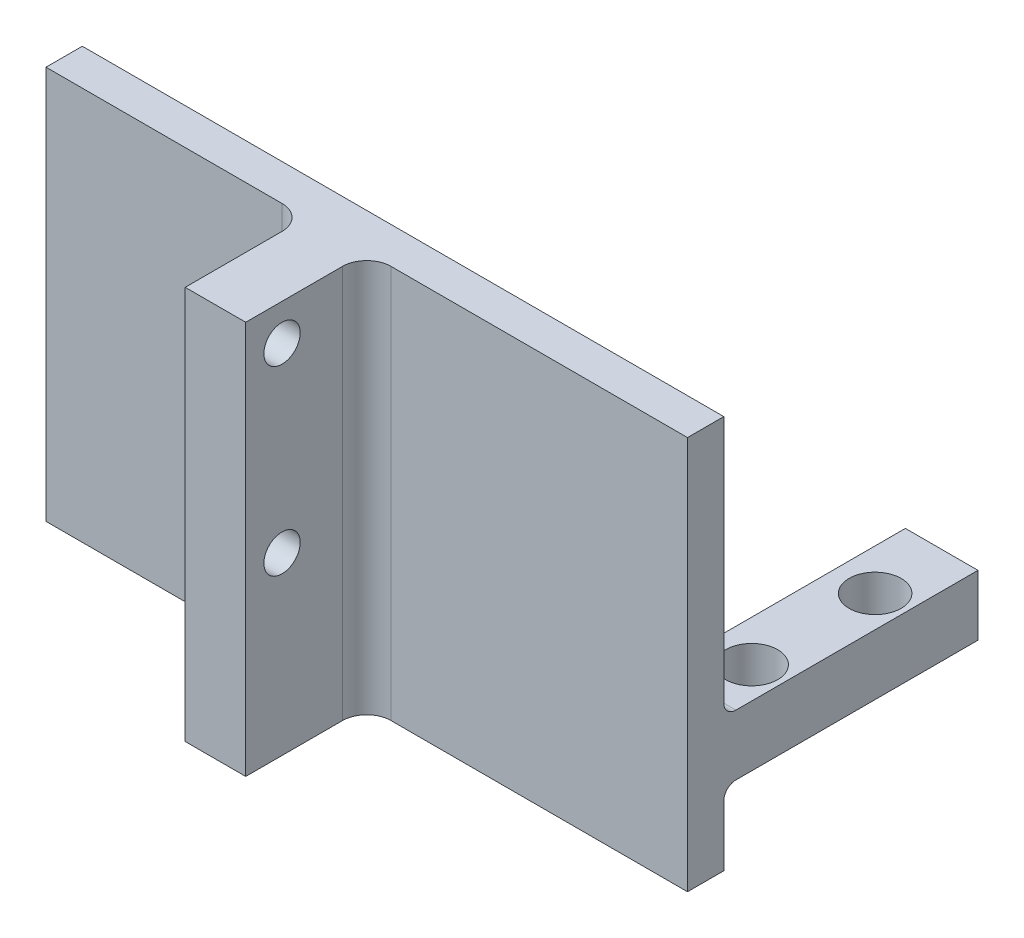
ISO-10303-21;
HEADER;
FILE_DESCRIPTION(('STEP AP214'),'2;1');
FILE_NAME('part.step','',(''),(''),'','','');
FILE_SCHEMA(('AUTOMOTIVE_DESIGN { 1 0 10303 214 1 1 1 1 }'));
ENDSEC;
DATA;
#1=APPLICATION_CONTEXT('core data for automotive mechanical design processes');
#2=APPLICATION_PROTOCOL_DEFINITION('international standard','automotive_design',2000,#1);
#3=PRODUCT_CONTEXT('',#1,'mechanical');
#4=PRODUCT('Part','Part','',(#3));
#5=PRODUCT_RELATED_PRODUCT_CATEGORY('part','',(#4));
#6=PRODUCT_DEFINITION_FORMATION('','',#4);
#7=PRODUCT_DEFINITION_CONTEXT('part definition',#1,'design');
#8=PRODUCT_DEFINITION('design','',#6,#7);
#9=PRODUCT_DEFINITION_SHAPE('','',#8);
#10=(LENGTH_UNIT() NAMED_UNIT(*) SI_UNIT(.MILLI.,.METRE.));
#11=(NAMED_UNIT(*) PLANE_ANGLE_UNIT() SI_UNIT($,.RADIAN.));
#12=(NAMED_UNIT(*) SI_UNIT($,.STERADIAN.) SOLID_ANGLE_UNIT());
#13=UNCERTAINTY_MEASURE_WITH_UNIT(LENGTH_MEASURE(1.E-05),#10,'distance_accuracy_value','');
#14=(GEOMETRIC_REPRESENTATION_CONTEXT(3) GLOBAL_UNCERTAINTY_ASSIGNED_CONTEXT((#13)) GLOBAL_UNIT_ASSIGNED_CONTEXT((#10,
#11,#12)) REPRESENTATION_CONTEXT('',''));
#15=CARTESIAN_POINT('',(0.,0.,0.));
#16=DIRECTION('',(0.,0.,1.));
#17=DIRECTION('',(1.,0.,0.));
#18=AXIS2_PLACEMENT_3D('',#15,#16,#17);
#19=CARTESIAN_POINT('',(0.,0.,3.));
#20=DIRECTION('',(0.,0.,1.));
#21=DIRECTION('',(1.,0.,0.));
#22=AXIS2_PLACEMENT_3D('',#19,#20,#21);
#23=PLANE('',#22);
#24=DIRECTION('',(-1.,0.,0.));
#25=VECTOR('',#24,1.);
#26=CARTESIAN_POINT('',(-26.5,21.5000000000001,3.));
#27=LINE('',#26,#25);
#28=CARTESIAN_POINT('',(26.5,21.5000000000001,3.));
#29=VERTEX_POINT('',#28);
#30=CARTESIAN_POINT('',(2.00000000000002,21.5000000000001,3.));
#31=VERTEX_POINT('',#30);
#32=EDGE_CURVE('E268',#29,#31,#27,.T.);
#33=ORIENTED_EDGE('',*,*,#32,.T.);
#34=DIRECTION('',(0.,1.,0.));
#35=VECTOR('',#34,1.);
#36=CARTESIAN_POINT('',(2.00000000000002,0.,3.));
#37=LINE('',#36,#35);
#38=CARTESIAN_POINT('',(2.00000000000002,-10.9999999999999,3.));
#39=VERTEX_POINT('',#38);
#40=EDGE_CURVE('E53',#31,#39,#37,.F.);
#41=ORIENTED_EDGE('',*,*,#40,.T.);
#42=DIRECTION('',(1.,0.,0.));
#43=VECTOR('',#42,1.);
#44=CARTESIAN_POINT('',(-26.5,-10.9999999999999,3.));
#45=LINE('',#44,#43);
#46=CARTESIAN_POINT('',(26.5,-10.9999999999999,3.));
#47=VERTEX_POINT('',#46);
#48=EDGE_CURVE('E260',#39,#47,#45,.T.);
#49=ORIENTED_EDGE('',*,*,#48,.T.);
#50=DIRECTION('',(0.,1.,0.));
#51=VECTOR('',#50,1.);
#52=CARTESIAN_POINT('',(26.5,21.5000000000001,3.));
#53=LINE('',#52,#51);
#54=EDGE_CURVE('E265',#47,#29,#53,.T.);
#55=ORIENTED_EDGE('',*,*,#54,.T.);
#56=EDGE_LOOP('',(#33,#41,#49,#55));
#57=FACE_BOUND('',#56,.T.);
#58=ADVANCED_FACE('F32',(#57),#23,.T.);
#59=CARTESIAN_POINT('',(0.,0.,0.));
#60=DIRECTION('',(0.,0.,1.));
#61=DIRECTION('',(1.,0.,0.));
#62=AXIS2_PLACEMENT_3D('',#59,#60,#61);
#63=PLANE('',#62);
#64=DIRECTION('',(0.,-1.,0.));
#65=VECTOR('',#64,1.);
#66=CARTESIAN_POINT('',(-20.5,-4.99999999999992,0.));
#67=LINE('',#66,#65);
#68=CARTESIAN_POINT('',(-20.5,1.00000000000009,0.));
#69=VERTEX_POINT('',#68);
#70=CARTESIAN_POINT('',(-20.5,-5.99999999999992,0.));
#71=VERTEX_POINT('',#70);
#72=EDGE_CURVE('E205',#69,#71,#67,.T.);
#73=ORIENTED_EDGE('',*,*,#72,.F.);
#74=DIRECTION('',(1.,0.,0.));
#75=VECTOR('',#74,1.);
#76=CARTESIAN_POINT('',(-26.5,1.00000000000009,0.));
#77=LINE('',#76,#75);
#78=CARTESIAN_POINT('',(-26.5,1.00000000000009,0.));
#79=VERTEX_POINT('',#78);
#80=EDGE_CURVE('E303',#69,#79,#77,.F.);
#81=ORIENTED_EDGE('',*,*,#80,.T.);
#82=DIRECTION('',(0.,-1.,0.));
#83=VECTOR('',#82,1.);
#84=CARTESIAN_POINT('',(-26.5,21.5000000000001,0.));
#85=LINE('',#84,#83);
#86=CARTESIAN_POINT('',(-26.5,21.5000000000001,0.));
#87=VERTEX_POINT('',#86);
#88=EDGE_CURVE('E271',#87,#79,#85,.T.);
#89=ORIENTED_EDGE('',*,*,#88,.F.);
#90=DIRECTION('',(-1.,0.,0.));
#91=VECTOR('',#90,1.);
#92=CARTESIAN_POINT('',(-26.5,21.5000000000001,0.));
#93=LINE('',#92,#91);
#94=CARTESIAN_POINT('',(26.5,21.5000000000001,0.));
#95=VERTEX_POINT('',#94);
#96=EDGE_CURVE('E261',#95,#87,#93,.T.);
#97=ORIENTED_EDGE('',*,*,#96,.F.);
#98=DIRECTION('',(0.,1.,0.));
#99=VECTOR('',#98,1.);
#100=CARTESIAN_POINT('',(26.5,21.5000000000001,0.));
#101=LINE('',#100,#99);
#102=CARTESIAN_POINT('',(26.5,1.00000000000008,0.));
#103=VERTEX_POINT('',#102);
#104=EDGE_CURVE('E276',#103,#95,#101,.T.);
#105=ORIENTED_EDGE('',*,*,#104,.F.);
#106=DIRECTION('',(1.,0.,0.));
#107=VECTOR('',#106,1.);
#108=CARTESIAN_POINT('',(20.5,1.00000000000008,0.));
#109=LINE('',#108,#107);
#110=CARTESIAN_POINT('',(20.5,1.00000000000008,0.));
#111=VERTEX_POINT('',#110);
#112=EDGE_CURVE('E295',#103,#111,#109,.F.);
#113=ORIENTED_EDGE('',*,*,#112,.T.);
#114=DIRECTION('',(0.,1.,0.));
#115=VECTOR('',#114,1.);
#116=CARTESIAN_POINT('',(20.5,-4.99999999999992,0.));
#117=LINE('',#116,#115);
#118=CARTESIAN_POINT('',(20.5,-5.99999999999992,0.));
#119=VERTEX_POINT('',#118);
#120=EDGE_CURVE('E233',#119,#111,#117,.T.);
#121=ORIENTED_EDGE('',*,*,#120,.F.);
#122=DIRECTION('',(-1.,0.,0.));
#123=VECTOR('',#122,1.);
#124=CARTESIAN_POINT('',(26.5,-5.99999999999992,0.));
#125=LINE('',#124,#123);
#126=CARTESIAN_POINT('',(26.5,-5.99999999999992,0.));
#127=VERTEX_POINT('',#126);
#128=EDGE_CURVE('E298',#119,#127,#125,.F.);
#129=ORIENTED_EDGE('',*,*,#128,.T.);
#130=CARTESIAN_POINT('',(26.5,-10.9999999999999,0.));
#131=VERTEX_POINT('',#130);
#132=EDGE_CURVE('E277',#131,#127,#101,.T.);
#133=ORIENTED_EDGE('',*,*,#132,.F.);
#134=DIRECTION('',(1.,0.,0.));
#135=VECTOR('',#134,1.);
#136=CARTESIAN_POINT('',(-26.5,-10.9999999999999,0.));
#137=LINE('',#136,#135);
#138=CARTESIAN_POINT('',(-26.5,-10.9999999999999,0.));
#139=VERTEX_POINT('',#138);
#140=EDGE_CURVE('E274',#139,#131,#137,.T.);
#141=ORIENTED_EDGE('',*,*,#140,.F.);
#142=CARTESIAN_POINT('',(-26.5,-5.99999999999992,0.));
#143=VERTEX_POINT('',#142);
#144=EDGE_CURVE('E256',#143,#139,#85,.T.);
#145=ORIENTED_EDGE('',*,*,#144,.F.);
#146=DIRECTION('',(-1.,0.,0.));
#147=VECTOR('',#146,1.);
#148=CARTESIAN_POINT('',(-20.5,-5.99999999999992,0.));
#149=LINE('',#148,#147);
#150=EDGE_CURVE('E300',#143,#71,#149,.F.);
#151=ORIENTED_EDGE('',*,*,#150,.T.);
#152=EDGE_LOOP('',(#73,#81,#89,#97,#105,#113,#121,#129,#133,#141,#145,#151));
#153=FACE_BOUND('',#152,.T.);
#154=ADVANCED_FACE('F362',(#153),#63,.F.);
#155=CARTESIAN_POINT('',(-26.5,21.5000000000001,3.));
#156=DIRECTION('',(1.,0.,0.));
#157=DIRECTION('',(0.,1.,0.));
#158=AXIS2_PLACEMENT_3D('',#155,#156,#157);
#159=PLANE('',#158);
#160=ORIENTED_EDGE('',*,*,#88,.T.);
#161=CARTESIAN_POINT('',(-26.5,1.00000000000009,-1.));
#162=DIRECTION('',(1.,0.,0.));
#163=DIRECTION('',(0.,1.,0.));
#164=AXIS2_PLACEMENT_3D('',#161,#162,#163);
#165=CIRCLE('',#164,1.);
#166=CARTESIAN_POINT('',(-26.5,0.,-1.00000000000001));
#167=VERTEX_POINT('',#166);
#168=EDGE_CURVE('E317',#79,#167,#165,.T.);
#169=ORIENTED_EDGE('',*,*,#168,.T.);
#170=DIRECTION('',(0.,0.,1.));
#171=VECTOR('',#170,1.);
#172=CARTESIAN_POINT('',(-26.5,0.,-21.));
#173=LINE('',#172,#171);
#174=CARTESIAN_POINT('',(-26.5,0.,-21.));
#175=VERTEX_POINT('',#174);
#176=EDGE_CURVE('E220',#175,#167,#173,.T.);
#177=ORIENTED_EDGE('',*,*,#176,.F.);
#178=DIRECTION('',(0.,1.,0.));
#179=VECTOR('',#178,1.);
#180=CARTESIAN_POINT('',(-26.5,0.,-21.));
#181=LINE('',#180,#179);
#182=CARTESIAN_POINT('',(-26.5,-4.99999999999992,-21.));
#183=VERTEX_POINT('',#182);
#184=EDGE_CURVE('E219',#183,#175,#181,.T.);
#185=ORIENTED_EDGE('',*,*,#184,.F.);
#186=DIRECTION('',(0.,0.,1.));
#187=VECTOR('',#186,1.);
#188=CARTESIAN_POINT('',(-26.5,-4.99999999999992,-21.));
#189=LINE('',#188,#187);
#190=CARTESIAN_POINT('',(-26.5,-4.99999999999992,-1.00000000000001));
#191=VERTEX_POINT('',#190);
#192=EDGE_CURVE('E224',#183,#191,#189,.T.);
#193=ORIENTED_EDGE('',*,*,#192,.T.);
#194=CARTESIAN_POINT('',(-26.5,-5.99999999999992,-1.));
#195=DIRECTION('',(1.,0.,0.));
#196=DIRECTION('',(0.,1.,0.));
#197=AXIS2_PLACEMENT_3D('',#194,#195,#196);
#198=CIRCLE('',#197,1.);
#199=EDGE_CURVE('E319',#191,#143,#198,.T.);
#200=ORIENTED_EDGE('',*,*,#199,.T.);
#201=ORIENTED_EDGE('',*,*,#144,.T.);
#202=DIRECTION('',(0.,0.,-1.));
#203=VECTOR('',#202,1.);
#204=CARTESIAN_POINT('',(-26.5,-10.9999999999999,3.));
#205=LINE('',#204,#203);
#206=CARTESIAN_POINT('',(-26.5,-10.9999999999999,3.));
#207=VERTEX_POINT('',#206);
#208=EDGE_CURVE('E289',#207,#139,#205,.T.);
#209=ORIENTED_EDGE('',*,*,#208,.F.);
#210=DIRECTION('',(0.,-1.,0.));
#211=VECTOR('',#210,1.);
#212=CARTESIAN_POINT('',(-26.5,21.5000000000001,3.));
#213=LINE('',#212,#211);
#214=CARTESIAN_POINT('',(-26.5,21.5000000000001,3.));
#215=VERTEX_POINT('',#214);
#216=EDGE_CURVE('E257',#215,#207,#213,.T.);
#217=ORIENTED_EDGE('',*,*,#216,.F.);
#218=DIRECTION('',(0.,0.,-1.));
#219=VECTOR('',#218,1.);
#220=CARTESIAN_POINT('',(-26.5,21.5000000000001,3.));
#221=LINE('',#220,#219);
#222=EDGE_CURVE('E270',#215,#87,#221,.T.);
#223=ORIENTED_EDGE('',*,*,#222,.T.);
#224=EDGE_LOOP('',(#160,#169,#177,#185,#193,#200,#201,#209,#217,#223));
#225=FACE_BOUND('',#224,.T.);
#226=ADVANCED_FACE('F367',(#225),#159,.F.);
#227=CARTESIAN_POINT('',(-26.5,-10.9999999999999,3.));
#228=DIRECTION('',(0.,1.,0.));
#229=DIRECTION('',(0.,0.,1.));
#230=AXIS2_PLACEMENT_3D('',#227,#228,#229);
#231=PLANE('',#230);
#232=ORIENTED_EDGE('',*,*,#140,.T.);
#233=DIRECTION('',(0.,0.,-1.));
#234=VECTOR('',#233,1.);
#235=CARTESIAN_POINT('',(26.5,-10.9999999999999,3.));
#236=LINE('',#235,#234);
#237=EDGE_CURVE('E286',#47,#131,#236,.T.);
#238=ORIENTED_EDGE('',*,*,#237,.F.);
#239=ORIENTED_EDGE('',*,*,#48,.F.);
#240=CARTESIAN_POINT('',(2.00000000000002,-10.9999999999999,5.));
#241=DIRECTION('',(0.,1.,0.));
#242=DIRECTION('',(0.,0.,1.));
#243=AXIS2_PLACEMENT_3D('',#240,#241,#242);
#244=CIRCLE('',#243,2.);
#245=CARTESIAN_POINT('',(0.,-10.9999999999999,5.));
#246=VERTEX_POINT('',#245);
#247=EDGE_CURVE('E11',#39,#246,#244,.T.);
#248=ORIENTED_EDGE('',*,*,#247,.T.);
#249=DIRECTION('',(0.,0.,-1.));
#250=VECTOR('',#249,1.);
#251=CARTESIAN_POINT('',(0.,-10.9999999999999,13.));
#252=LINE('',#251,#250);
#253=CARTESIAN_POINT('',(0.,-10.9999999999999,13.));
#254=VERTEX_POINT('',#253);
#255=EDGE_CURVE('E209',#254,#246,#252,.T.);
#256=ORIENTED_EDGE('',*,*,#255,.F.);
#257=DIRECTION('',(1.,0.,0.));
#258=VECTOR('',#257,1.);
#259=CARTESIAN_POINT('',(0.,-10.9999999999999,13.));
#260=LINE('',#259,#258);
#261=CARTESIAN_POINT('',(-4.99999999999997,-10.9999999999999,13.));
#262=VERTEX_POINT('',#261);
#263=EDGE_CURVE('E191',#262,#254,#260,.T.);
#264=ORIENTED_EDGE('',*,*,#263,.F.);
#265=DIRECTION('',(0.,0.,-1.));
#266=VECTOR('',#265,1.);
#267=CARTESIAN_POINT('',(-4.99999999999997,-10.9999999999999,13.));
#268=LINE('',#267,#266);
#269=CARTESIAN_POINT('',(-4.99999999999997,-10.9999999999999,5.));
#270=VERTEX_POINT('',#269);
#271=EDGE_CURVE('E188',#262,#270,#268,.T.);
#272=ORIENTED_EDGE('',*,*,#271,.T.);
#273=CARTESIAN_POINT('',(-6.99999999999997,-10.9999999999999,5.));
#274=DIRECTION('',(0.,1.,0.));
#275=DIRECTION('',(0.,0.,1.));
#276=AXIS2_PLACEMENT_3D('',#273,#274,#275);
#277=CIRCLE('',#276,2.);
#278=CARTESIAN_POINT('',(-6.99999999999997,-10.9999999999999,3.));
#279=VERTEX_POINT('',#278);
#280=EDGE_CURVE('E340',#270,#279,#277,.T.);
#281=ORIENTED_EDGE('',*,*,#280,.T.);
#282=EDGE_CURVE('E262',#207,#279,#45,.T.);
#283=ORIENTED_EDGE('',*,*,#282,.F.);
#284=ORIENTED_EDGE('',*,*,#208,.T.);
#285=EDGE_LOOP('',(#232,#238,#239,#248,#256,#264,#272,#281,#283,#284));
#286=FACE_BOUND('',#285,.T.);
#287=ADVANCED_FACE('F343',(#286),#231,.F.);
#288=CARTESIAN_POINT('',(26.5,21.5000000000001,3.));
#289=DIRECTION('',(-1.,0.,0.));
#290=DIRECTION('',(0.,-1.,0.));
#291=AXIS2_PLACEMENT_3D('',#288,#289,#290);
#292=PLANE('',#291);
#293=ORIENTED_EDGE('',*,*,#132,.T.);
#294=CARTESIAN_POINT('',(26.5,-5.99999999999992,-1.));
#295=DIRECTION('',(-1.,0.,0.));
#296=DIRECTION('',(0.,-1.,0.));
#297=AXIS2_PLACEMENT_3D('',#294,#295,#296);
#298=CIRCLE('',#297,1.);
#299=CARTESIAN_POINT('',(26.5,-4.99999999999992,-1.00000000000001));
#300=VERTEX_POINT('',#299);
#301=EDGE_CURVE('E326',#127,#300,#298,.T.);
#302=ORIENTED_EDGE('',*,*,#301,.T.);
#303=DIRECTION('',(0.,0.,1.));
#304=VECTOR('',#303,1.);
#305=CARTESIAN_POINT('',(26.5,-4.99999999999992,-21.));
#306=LINE('',#305,#304);
#307=CARTESIAN_POINT('',(26.5,-4.99999999999992,-21.));
#308=VERTEX_POINT('',#307);
#309=EDGE_CURVE('E247',#308,#300,#306,.T.);
#310=ORIENTED_EDGE('',*,*,#309,.F.);
#311=DIRECTION('',(0.,-1.,0.));
#312=VECTOR('',#311,1.);
#313=CARTESIAN_POINT('',(26.5,0.,-21.));
#314=LINE('',#313,#312);
#315=CARTESIAN_POINT('',(26.5,0.,-21.));
#316=VERTEX_POINT('',#315);
#317=EDGE_CURVE('E239',#316,#308,#314,.T.);
#318=ORIENTED_EDGE('',*,*,#317,.F.);
#319=DIRECTION('',(0.,0.,1.));
#320=VECTOR('',#319,1.);
#321=CARTESIAN_POINT('',(26.5,0.,-21.));
#322=LINE('',#321,#320);
#323=CARTESIAN_POINT('',(26.5,0.,-1.00000000000001));
#324=VERTEX_POINT('',#323);
#325=EDGE_CURVE('E250',#316,#324,#322,.T.);
#326=ORIENTED_EDGE('',*,*,#325,.T.);
#327=CARTESIAN_POINT('',(26.5,1.00000000000008,-1.));
#328=DIRECTION('',(-1.,0.,0.));
#329=DIRECTION('',(0.,-1.,0.));
#330=AXIS2_PLACEMENT_3D('',#327,#328,#329);
#331=CIRCLE('',#330,1.);
#332=EDGE_CURVE('E328',#324,#103,#331,.T.);
#333=ORIENTED_EDGE('',*,*,#332,.T.);
#334=ORIENTED_EDGE('',*,*,#104,.T.);
#335=DIRECTION('',(0.,0.,-1.));
#336=VECTOR('',#335,1.);
#337=CARTESIAN_POINT('',(26.5,21.5000000000001,3.));
#338=LINE('',#337,#336);
#339=EDGE_CURVE('E283',#29,#95,#338,.T.);
#340=ORIENTED_EDGE('',*,*,#339,.F.);
#341=ORIENTED_EDGE('',*,*,#54,.F.);
#342=ORIENTED_EDGE('',*,*,#237,.T.);
#343=EDGE_LOOP('',(#293,#302,#310,#318,#326,#333,#334,#340,#341,#342));
#344=FACE_BOUND('',#343,.T.);
#345=ADVANCED_FACE('F379',(#344),#292,.F.);
#346=CARTESIAN_POINT('',(-26.5,21.5000000000001,3.));
#347=DIRECTION('',(0.,-1.,0.));
#348=DIRECTION('',(0.,0.,-1.));
#349=AXIS2_PLACEMENT_3D('',#346,#347,#348);
#350=PLANE('',#349);
#351=ORIENTED_EDGE('',*,*,#96,.T.);
#352=ORIENTED_EDGE('',*,*,#222,.F.);
#353=CARTESIAN_POINT('',(-6.99999999999998,21.5000000000001,3.));
#354=VERTEX_POINT('',#353);
#355=EDGE_CURVE('E267',#354,#215,#27,.T.);
#356=ORIENTED_EDGE('',*,*,#355,.F.);
#357=CARTESIAN_POINT('',(-6.99999999999998,21.5000000000001,5.));
#358=DIRECTION('',(0.,-1.,0.));
#359=DIRECTION('',(0.,0.,-1.));
#360=AXIS2_PLACEMENT_3D('',#357,#358,#359);
#361=CIRCLE('',#360,2.);
#362=CARTESIAN_POINT('',(-4.99999999999998,21.5000000000001,5.));
#363=VERTEX_POINT('',#362);
#364=EDGE_CURVE('E204',#354,#363,#361,.T.);
#365=ORIENTED_EDGE('',*,*,#364,.T.);
#366=DIRECTION('',(0.,0.,-1.));
#367=VECTOR('',#366,1.);
#368=CARTESIAN_POINT('',(-4.99999999999998,21.5000000000001,13.));
#369=LINE('',#368,#367);
#370=CARTESIAN_POINT('',(-4.99999999999998,21.5000000000001,13.));
#371=VERTEX_POINT('',#370);
#372=EDGE_CURVE('E185',#371,#363,#369,.T.);
#373=ORIENTED_EDGE('',*,*,#372,.F.);
#374=DIRECTION('',(-1.,0.,0.));
#375=VECTOR('',#374,1.);
#376=CARTESIAN_POINT('',(-4.99999999999998,21.5000000000001,13.));
#377=LINE('',#376,#375);
#378=CARTESIAN_POINT('',(0.,21.5000000000001,13.));
#379=VERTEX_POINT('',#378);
#380=EDGE_CURVE('E192',#379,#371,#377,.T.);
#381=ORIENTED_EDGE('',*,*,#380,.F.);
#382=DIRECTION('',(0.,0.,-1.));
#383=VECTOR('',#382,1.);
#384=CARTESIAN_POINT('',(0.,21.5000000000001,13.));
#385=LINE('',#384,#383);
#386=CARTESIAN_POINT('',(0.,21.5000000000001,5.));
#387=VERTEX_POINT('',#386);
#388=EDGE_CURVE('E465',#379,#387,#385,.T.);
#389=ORIENTED_EDGE('',*,*,#388,.T.);
#390=CARTESIAN_POINT('',(2.00000000000002,21.5000000000001,5.));
#391=DIRECTION('',(0.,-1.,0.));
#392=DIRECTION('',(0.,0.,-1.));
#393=AXIS2_PLACEMENT_3D('',#390,#391,#392);
#394=CIRCLE('',#393,2.);
#395=EDGE_CURVE('E40',#387,#31,#394,.T.);
#396=ORIENTED_EDGE('',*,*,#395,.T.);
#397=ORIENTED_EDGE('',*,*,#32,.F.);
#398=ORIENTED_EDGE('',*,*,#339,.T.);
#399=EDGE_LOOP('',(#351,#352,#356,#365,#373,#381,#389,#396,#397,#398));
#400=FACE_BOUND('',#399,.T.);
#401=ADVANCED_FACE('F201',(#400),#350,.F.);
#402=ORIENTED_EDGE('',*,*,#282,.T.);
#403=DIRECTION('',(0.,-1.,0.));
#404=VECTOR('',#403,1.);
#405=CARTESIAN_POINT('',(-6.99999999999997,0.,3.));
#406=LINE('',#405,#404);
#407=EDGE_CURVE('E334',#279,#354,#406,.F.);
#408=ORIENTED_EDGE('',*,*,#407,.T.);
#409=ORIENTED_EDGE('',*,*,#355,.T.);
#410=ORIENTED_EDGE('',*,*,#216,.T.);
#411=EDGE_LOOP('',(#402,#408,#409,#410));
#412=FACE_BOUND('',#411,.T.);
#413=ADVANCED_FACE('F347',(#412),#23,.T.);
#414=CARTESIAN_POINT('',(20.5,-4.99999999999992,-21.));
#415=DIRECTION('',(1.,0.,0.));
#416=DIRECTION('',(0.,0.,-1.));
#417=AXIS2_PLACEMENT_3D('',#414,#415,#416);
#418=PLANE('',#417);
#419=ORIENTED_EDGE('',*,*,#120,.T.);
#420=CARTESIAN_POINT('',(20.5,1.00000000000008,-1.));
#421=DIRECTION('',(1.,0.,0.));
#422=DIRECTION('',(0.,0.,-1.));
#423=AXIS2_PLACEMENT_3D('',#420,#421,#422);
#424=CIRCLE('',#423,1.);
#425=CARTESIAN_POINT('',(20.5,0.,-1.00000000000001));
#426=VERTEX_POINT('',#425);
#427=EDGE_CURVE('E330',#111,#426,#424,.T.);
#428=ORIENTED_EDGE('',*,*,#427,.T.);
#429=DIRECTION('',(0.,0.,1.));
#430=VECTOR('',#429,1.);
#431=CARTESIAN_POINT('',(20.5,0.,-21.));
#432=LINE('',#431,#430);
#433=CARTESIAN_POINT('',(20.5,0.,-21.));
#434=VERTEX_POINT('',#433);
#435=EDGE_CURVE('E253',#434,#426,#432,.T.);
#436=ORIENTED_EDGE('',*,*,#435,.F.);
#437=DIRECTION('',(0.,1.,0.));
#438=VECTOR('',#437,1.);
#439=CARTESIAN_POINT('',(20.5,-4.99999999999992,-21.));
#440=LINE('',#439,#438);
#441=CARTESIAN_POINT('',(20.5,-4.99999999999992,-21.));
#442=VERTEX_POINT('',#441);
#443=EDGE_CURVE('E234',#442,#434,#440,.T.);
#444=ORIENTED_EDGE('',*,*,#443,.F.);
#445=DIRECTION('',(0.,0.,1.));
#446=VECTOR('',#445,1.);
#447=CARTESIAN_POINT('',(20.5,-4.99999999999992,-21.));
#448=LINE('',#447,#446);
#449=CARTESIAN_POINT('',(20.5,-4.99999999999992,-1.00000000000001));
#450=VERTEX_POINT('',#449);
#451=EDGE_CURVE('E243',#442,#450,#448,.T.);
#452=ORIENTED_EDGE('',*,*,#451,.T.);
#453=CARTESIAN_POINT('',(20.5,-5.99999999999992,-1.));
#454=DIRECTION('',(1.,0.,0.));
#455=DIRECTION('',(0.,0.,-1.));
#456=AXIS2_PLACEMENT_3D('',#453,#454,#455);
#457=CIRCLE('',#456,1.);
#458=EDGE_CURVE('E323',#450,#119,#457,.T.);
#459=ORIENTED_EDGE('',*,*,#458,.T.);
#460=EDGE_LOOP('',(#419,#428,#436,#444,#452,#459));
#461=FACE_BOUND('',#460,.T.);
#462=ADVANCED_FACE('F372',(#461),#418,.F.);
#463=CARTESIAN_POINT('',(20.5,0.,-21.));
#464=DIRECTION('',(0.,-1.,0.));
#465=DIRECTION('',(1.,0.,0.));
#466=AXIS2_PLACEMENT_3D('',#463,#464,#465);
#467=PLANE('',#466);
#468=CARTESIAN_POINT('',(23.9,0.,-15.1));
#469=DIRECTION('',(0.,-1.,0.));
#470=DIRECTION('',(1.,0.,0.));
#471=AXIS2_PLACEMENT_3D('',#468,#469,#470);
#472=CIRCLE('',#471,2.15);
#473=CARTESIAN_POINT('',(26.05,0.,-15.1));
#474=VERTEX_POINT('',#473);
#475=EDGE_CURVE('E199',#474,#474,#472,.T.);
#476=ORIENTED_EDGE('',*,*,#475,.T.);
#477=EDGE_LOOP('',(#476));
#478=FACE_BOUND('',#477,.T.);
#479=CARTESIAN_POINT('',(23.9,0.,-4.9));
#480=DIRECTION('',(0.,-1.,0.));
#481=DIRECTION('',(1.,0.,0.));
#482=AXIS2_PLACEMENT_3D('',#479,#480,#481);
#483=CIRCLE('',#482,2.15);
#484=CARTESIAN_POINT('',(26.05,0.,-4.9));
#485=VERTEX_POINT('',#484);
#486=EDGE_CURVE('E472',#485,#485,#483,.T.);
#487=ORIENTED_EDGE('',*,*,#486,.T.);
#488=EDGE_LOOP('',(#487));
#489=FACE_BOUND('',#488,.T.);
#490=ORIENTED_EDGE('',*,*,#435,.T.);
#491=DIRECTION('',(1.,0.,0.));
#492=VECTOR('',#491,1.);
#493=CARTESIAN_POINT('',(26.5,0.,-1.));
#494=LINE('',#493,#492);
#495=EDGE_CURVE('E311',#426,#324,#494,.T.);
#496=ORIENTED_EDGE('',*,*,#495,.T.);
#497=ORIENTED_EDGE('',*,*,#325,.F.);
#498=DIRECTION('',(1.,0.,0.));
#499=VECTOR('',#498,1.);
#500=CARTESIAN_POINT('',(20.5,0.,-21.));
#501=LINE('',#500,#499);
#502=EDGE_CURVE('E237',#434,#316,#501,.T.);
#503=ORIENTED_EDGE('',*,*,#502,.F.);
#504=EDGE_LOOP('',(#490,#496,#497,#503));
#505=FACE_BOUND('',#504,.T.);
#506=ADVANCED_FACE('F377',(#478,#489,#505),#467,.F.);
#507=CARTESIAN_POINT('',(20.5,-4.99999999999992,-21.));
#508=DIRECTION('',(0.,1.,0.));
#509=DIRECTION('',(0.,0.,1.));
#510=AXIS2_PLACEMENT_3D('',#507,#508,#509);
#511=PLANE('',#510);
#512=CARTESIAN_POINT('',(23.9,-4.99999999999992,-15.1));
#513=DIRECTION('',(0.,-1.,0.));
#514=DIRECTION('',(0.,0.,-1.));
#515=AXIS2_PLACEMENT_3D('',#512,#513,#514);
#516=CIRCLE('',#515,2.15);
#517=CARTESIAN_POINT('',(23.9,-4.99999999999992,-17.25));
#518=VERTEX_POINT('',#517);
#519=EDGE_CURVE('E484',#518,#518,#516,.T.);
#520=ORIENTED_EDGE('',*,*,#519,.F.);
#521=EDGE_LOOP('',(#520));
#522=FACE_BOUND('',#521,.T.);
#523=CARTESIAN_POINT('',(23.9,-4.99999999999992,-4.9));
#524=DIRECTION('',(0.,-1.,0.));
#525=DIRECTION('',(0.,0.,-1.));
#526=AXIS2_PLACEMENT_3D('',#523,#524,#525);
#527=CIRCLE('',#526,2.15);
#528=CARTESIAN_POINT('',(23.9,-4.99999999999992,-7.05));
#529=VERTEX_POINT('',#528);
#530=EDGE_CURVE('E481',#529,#529,#527,.T.);
#531=ORIENTED_EDGE('',*,*,#530,.F.);
#532=EDGE_LOOP('',(#531));
#533=FACE_BOUND('',#532,.T.);
#534=ORIENTED_EDGE('',*,*,#309,.T.);
#535=DIRECTION('',(-1.,0.,0.));
#536=VECTOR('',#535,1.);
#537=CARTESIAN_POINT('',(20.5,-4.99999999999992,-1.));
#538=LINE('',#537,#536);
#539=EDGE_CURVE('E308',#300,#450,#538,.T.);
#540=ORIENTED_EDGE('',*,*,#539,.T.);
#541=ORIENTED_EDGE('',*,*,#451,.F.);
#542=DIRECTION('',(-1.,0.,0.));
#543=VECTOR('',#542,1.);
#544=CARTESIAN_POINT('',(20.5,-4.99999999999992,-21.));
#545=LINE('',#544,#543);
#546=EDGE_CURVE('E241',#308,#442,#545,.T.);
#547=ORIENTED_EDGE('',*,*,#546,.F.);
#548=EDGE_LOOP('',(#534,#540,#541,#547));
#549=FACE_BOUND('',#548,.T.);
#550=ADVANCED_FACE('F426',(#522,#533,#549),#511,.F.);
#551=CARTESIAN_POINT('',(0.,0.,-21.));
#552=DIRECTION('',(0.,0.,-1.));
#553=DIRECTION('',(-1.,0.,0.));
#554=AXIS2_PLACEMENT_3D('',#551,#552,#553);
#555=PLANE('',#554);
#556=ORIENTED_EDGE('',*,*,#443,.T.);
#557=ORIENTED_EDGE('',*,*,#502,.T.);
#558=ORIENTED_EDGE('',*,*,#317,.T.);
#559=ORIENTED_EDGE('',*,*,#546,.T.);
#560=EDGE_LOOP('',(#556,#557,#558,#559));
#561=FACE_BOUND('',#560,.T.);
#562=ADVANCED_FACE('F421',(#561),#555,.T.);
#563=CARTESIAN_POINT('',(-20.5,0.,-21.));
#564=DIRECTION('',(0.,-1.,0.));
#565=DIRECTION('',(1.,0.,0.));
#566=AXIS2_PLACEMENT_3D('',#563,#564,#565);
#567=PLANE('',#566);
#568=CARTESIAN_POINT('',(-23.9,0.,-4.9));
#569=DIRECTION('',(0.,-1.,0.));
#570=DIRECTION('',(1.,0.,0.));
#571=AXIS2_PLACEMENT_3D('',#568,#569,#570);
#572=CIRCLE('',#571,2.15);
#573=CARTESIAN_POINT('',(-21.75,0.,-4.9));
#574=VERTEX_POINT('',#573);
#575=EDGE_CURVE('E475',#574,#574,#572,.T.);
#576=ORIENTED_EDGE('',*,*,#575,.T.);
#577=EDGE_LOOP('',(#576));
#578=FACE_BOUND('',#577,.T.);
#579=CARTESIAN_POINT('',(-23.9,0.,-15.1));
#580=DIRECTION('',(0.,-1.,0.));
#581=DIRECTION('',(1.,0.,0.));
#582=AXIS2_PLACEMENT_3D('',#579,#580,#581);
#583=CIRCLE('',#582,2.15);
#584=CARTESIAN_POINT('',(-21.75,0.,-15.1));
#585=VERTEX_POINT('',#584);
#586=EDGE_CURVE('E478',#585,#585,#583,.T.);
#587=ORIENTED_EDGE('',*,*,#586,.T.);
#588=EDGE_LOOP('',(#587));
#589=FACE_BOUND('',#588,.T.);
#590=ORIENTED_EDGE('',*,*,#176,.T.);
#591=DIRECTION('',(1.,0.,0.));
#592=VECTOR('',#591,1.);
#593=CARTESIAN_POINT('',(-20.5,0.,-1.));
#594=LINE('',#593,#592);
#595=CARTESIAN_POINT('',(-20.5,0.,-1.00000000000001));
#596=VERTEX_POINT('',#595);
#597=EDGE_CURVE('E292',#167,#596,#594,.T.);
#598=ORIENTED_EDGE('',*,*,#597,.T.);
#599=DIRECTION('',(0.,0.,1.));
#600=VECTOR('',#599,1.);
#601=CARTESIAN_POINT('',(-20.5,0.,-21.));
#602=LINE('',#601,#600);
#603=CARTESIAN_POINT('',(-20.5,0.,-21.));
#604=VERTEX_POINT('',#603);
#605=EDGE_CURVE('E230',#604,#596,#602,.T.);
#606=ORIENTED_EDGE('',*,*,#605,.F.);
#607=DIRECTION('',(1.,0.,0.));
#608=VECTOR('',#607,1.);
#609=CARTESIAN_POINT('',(-20.5,0.,-21.));
#610=LINE('',#609,#608);
#611=EDGE_CURVE('E207',#175,#604,#610,.T.);
#612=ORIENTED_EDGE('',*,*,#611,.F.);
#613=EDGE_LOOP('',(#590,#598,#606,#612));
#614=FACE_BOUND('',#613,.T.);
#615=ADVANCED_FACE('F454',(#578,#589,#614),#567,.F.);
#616=CARTESIAN_POINT('',(-20.5,-4.99999999999992,-21.));
#617=DIRECTION('',(-1.,0.,0.));
#618=DIRECTION('',(0.,0.,1.));
#619=AXIS2_PLACEMENT_3D('',#616,#617,#618);
#620=PLANE('',#619);
#621=ORIENTED_EDGE('',*,*,#72,.T.);
#622=CARTESIAN_POINT('',(-20.5,-5.99999999999992,-1.));
#623=DIRECTION('',(-1.,0.,0.));
#624=DIRECTION('',(0.,0.,1.));
#625=AXIS2_PLACEMENT_3D('',#622,#623,#624);
#626=CIRCLE('',#625,1.);
#627=CARTESIAN_POINT('',(-20.5,-4.99999999999992,-1.00000000000001));
#628=VERTEX_POINT('',#627);
#629=EDGE_CURVE('E321',#71,#628,#626,.T.);
#630=ORIENTED_EDGE('',*,*,#629,.T.);
#631=DIRECTION('',(0.,0.,1.));
#632=VECTOR('',#631,1.);
#633=CARTESIAN_POINT('',(-20.5,-4.99999999999992,-21.));
#634=LINE('',#633,#632);
#635=CARTESIAN_POINT('',(-20.5,-4.99999999999992,-21.));
#636=VERTEX_POINT('',#635);
#637=EDGE_CURVE('E227',#636,#628,#634,.T.);
#638=ORIENTED_EDGE('',*,*,#637,.F.);
#639=DIRECTION('',(0.,-1.,0.));
#640=VECTOR('',#639,1.);
#641=CARTESIAN_POINT('',(-20.5,-4.99999999999992,-21.));
#642=LINE('',#641,#640);
#643=EDGE_CURVE('E215',#604,#636,#642,.T.);
#644=ORIENTED_EDGE('',*,*,#643,.F.);
#645=ORIENTED_EDGE('',*,*,#605,.T.);
#646=CARTESIAN_POINT('',(-20.5,1.00000000000009,-1.));
#647=DIRECTION('',(-1.,0.,0.));
#648=DIRECTION('',(0.,0.,1.));
#649=AXIS2_PLACEMENT_3D('',#646,#647,#648);
#650=CIRCLE('',#649,1.);
#651=EDGE_CURVE('E314',#596,#69,#650,.T.);
#652=ORIENTED_EDGE('',*,*,#651,.T.);
#653=EDGE_LOOP('',(#621,#630,#638,#644,#645,#652));
#654=FACE_BOUND('',#653,.T.);
#655=ADVANCED_FACE('F442',(#654),#620,.F.);
#656=CARTESIAN_POINT('',(-20.5,-4.99999999999992,-21.));
#657=DIRECTION('',(0.,1.,0.));
#658=DIRECTION('',(0.,0.,1.));
#659=AXIS2_PLACEMENT_3D('',#656,#657,#658);
#660=PLANE('',#659);
#661=CARTESIAN_POINT('',(-23.9,-4.99999999999992,-4.9));
#662=DIRECTION('',(0.,-1.,0.));
#663=DIRECTION('',(0.,0.,-1.));
#664=AXIS2_PLACEMENT_3D('',#661,#662,#663);
#665=CIRCLE('',#664,2.15);
#666=CARTESIAN_POINT('',(-23.9,-4.99999999999992,-7.05));
#667=VERTEX_POINT('',#666);
#668=EDGE_CURVE('E485',#667,#667,#665,.T.);
#669=ORIENTED_EDGE('',*,*,#668,.F.);
#670=EDGE_LOOP('',(#669));
#671=FACE_BOUND('',#670,.T.);
#672=CARTESIAN_POINT('',(-23.9,-4.99999999999992,-15.1));
#673=DIRECTION('',(0.,-1.,0.));
#674=DIRECTION('',(0.,0.,-1.));
#675=AXIS2_PLACEMENT_3D('',#672,#673,#674);
#676=CIRCLE('',#675,2.15);
#677=CARTESIAN_POINT('',(-23.9,-4.99999999999992,-17.25));
#678=VERTEX_POINT('',#677);
#679=EDGE_CURVE('E488',#678,#678,#676,.T.);
#680=ORIENTED_EDGE('',*,*,#679,.F.);
#681=EDGE_LOOP('',(#680));
#682=FACE_BOUND('',#681,.T.);
#683=ORIENTED_EDGE('',*,*,#637,.T.);
#684=DIRECTION('',(-1.,0.,0.));
#685=VECTOR('',#684,1.);
#686=CARTESIAN_POINT('',(-26.5,-4.99999999999992,-1.));
#687=LINE('',#686,#685);
#688=EDGE_CURVE('E305',#628,#191,#687,.T.);
#689=ORIENTED_EDGE('',*,*,#688,.T.);
#690=ORIENTED_EDGE('',*,*,#192,.F.);
#691=DIRECTION('',(-1.,0.,0.));
#692=VECTOR('',#691,1.);
#693=CARTESIAN_POINT('',(-20.5,-4.99999999999992,-21.));
#694=LINE('',#693,#692);
#695=EDGE_CURVE('E217',#636,#183,#694,.T.);
#696=ORIENTED_EDGE('',*,*,#695,.F.);
#697=EDGE_LOOP('',(#683,#689,#690,#696));
#698=FACE_BOUND('',#697,.T.);
#699=ADVANCED_FACE('F445',(#671,#682,#698),#660,.F.);
#700=CARTESIAN_POINT('',(0.,0.,-21.));
#701=DIRECTION('',(0.,0.,1.));
#702=DIRECTION('',(1.,0.,0.));
#703=AXIS2_PLACEMENT_3D('',#700,#701,#702);
#704=PLANE('',#703);
#705=ORIENTED_EDGE('',*,*,#611,.T.);
#706=ORIENTED_EDGE('',*,*,#643,.T.);
#707=ORIENTED_EDGE('',*,*,#695,.T.);
#708=ORIENTED_EDGE('',*,*,#184,.T.);
#709=EDGE_LOOP('',(#705,#706,#707,#708));
#710=FACE_BOUND('',#709,.T.);
#711=ADVANCED_FACE('F396',(#710),#704,.F.);
#712=CARTESIAN_POINT('',(-20.5,1.00000000000009,-1.));
#713=DIRECTION('',(-1.,0.,0.));
#714=DIRECTION('',(0.,-1.,0.));
#715=AXIS2_PLACEMENT_3D('',#712,#713,#714);
#716=CYLINDRICAL_SURFACE('',#715,1.);
#717=ORIENTED_EDGE('',*,*,#168,.F.);
#718=ORIENTED_EDGE('',*,*,#80,.F.);
#719=ORIENTED_EDGE('',*,*,#651,.F.);
#720=ORIENTED_EDGE('',*,*,#597,.F.);
#721=EDGE_LOOP('',(#717,#718,#719,#720));
#722=FACE_BOUND('',#721,.T.);
#723=ADVANCED_FACE('F392',(#722),#716,.F.);
#724=CARTESIAN_POINT('',(-20.5,-5.99999999999992,-1.));
#725=DIRECTION('',(1.,0.,0.));
#726=DIRECTION('',(0.,0.,-1.));
#727=AXIS2_PLACEMENT_3D('',#724,#725,#726);
#728=CYLINDRICAL_SURFACE('',#727,1.);
#729=ORIENTED_EDGE('',*,*,#629,.F.);
#730=ORIENTED_EDGE('',*,*,#150,.F.);
#731=ORIENTED_EDGE('',*,*,#199,.F.);
#732=ORIENTED_EDGE('',*,*,#688,.F.);
#733=EDGE_LOOP('',(#729,#730,#731,#732));
#734=FACE_BOUND('',#733,.T.);
#735=ADVANCED_FACE('F395',(#734),#728,.F.);
#736=CARTESIAN_POINT('',(20.5,-5.99999999999992,-1.));
#737=DIRECTION('',(1.,0.,0.));
#738=DIRECTION('',(0.,0.,-1.));
#739=AXIS2_PLACEMENT_3D('',#736,#737,#738);
#740=CYLINDRICAL_SURFACE('',#739,1.);
#741=ORIENTED_EDGE('',*,*,#301,.F.);
#742=ORIENTED_EDGE('',*,*,#128,.F.);
#743=ORIENTED_EDGE('',*,*,#458,.F.);
#744=ORIENTED_EDGE('',*,*,#539,.F.);
#745=EDGE_LOOP('',(#741,#742,#743,#744));
#746=FACE_BOUND('',#745,.T.);
#747=ADVANCED_FACE('F400',(#746),#740,.F.);
#748=CARTESIAN_POINT('',(20.5,1.00000000000008,-1.));
#749=DIRECTION('',(-1.,0.,0.));
#750=DIRECTION('',(0.,-1.,0.));
#751=AXIS2_PLACEMENT_3D('',#748,#749,#750);
#752=CYLINDRICAL_SURFACE('',#751,1.);
#753=ORIENTED_EDGE('',*,*,#427,.F.);
#754=ORIENTED_EDGE('',*,*,#112,.F.);
#755=ORIENTED_EDGE('',*,*,#332,.F.);
#756=ORIENTED_EDGE('',*,*,#495,.F.);
#757=EDGE_LOOP('',(#753,#754,#755,#756));
#758=FACE_BOUND('',#757,.T.);
#759=ADVANCED_FACE('F403',(#758),#752,.F.);
#760=CARTESIAN_POINT('',(-4.99999999999998,21.5000000000001,13.));
#761=DIRECTION('',(1.,0.,0.));
#762=DIRECTION('',(0.,1.,0.));
#763=AXIS2_PLACEMENT_3D('',#760,#761,#762);
#764=PLANE('',#763);
#765=CARTESIAN_POINT('',(-4.99999999999998,18.5000000000001,10.));
#766=DIRECTION('',(1.,0.,0.));
#767=DIRECTION('',(0.,1.,0.));
#768=AXIS2_PLACEMENT_3D('',#765,#766,#767);
#769=CIRCLE('',#768,1.5);
#770=CARTESIAN_POINT('',(-4.99999999999998,20.0000000000001,10.));
#771=VERTEX_POINT('',#770);
#772=EDGE_CURVE('E493',#771,#771,#769,.T.);
#773=ORIENTED_EDGE('',*,*,#772,.T.);
#774=EDGE_LOOP('',(#773));
#775=FACE_BOUND('',#774,.T.);
#776=CARTESIAN_POINT('',(-4.99999999999997,3.50000000000009,10.));
#777=DIRECTION('',(1.,0.,0.));
#778=DIRECTION('',(0.,1.,0.));
#779=AXIS2_PLACEMENT_3D('',#776,#777,#778);
#780=CIRCLE('',#779,1.5);
#781=CARTESIAN_POINT('',(-4.99999999999997,5.00000000000009,10.));
#782=VERTEX_POINT('',#781);
#783=EDGE_CURVE('E496',#782,#782,#780,.T.);
#784=ORIENTED_EDGE('',*,*,#783,.T.);
#785=EDGE_LOOP('',(#784));
#786=FACE_BOUND('',#785,.T.);
#787=ORIENTED_EDGE('',*,*,#372,.T.);
#788=DIRECTION('',(0.,-1.,0.));
#789=VECTOR('',#788,1.);
#790=CARTESIAN_POINT('',(-4.99999999999998,21.5000000000001,5.));
#791=LINE('',#790,#789);
#792=EDGE_CURVE('E332',#363,#270,#791,.T.);
#793=ORIENTED_EDGE('',*,*,#792,.T.);
#794=ORIENTED_EDGE('',*,*,#271,.F.);
#795=DIRECTION('',(0.,-1.,0.));
#796=VECTOR('',#795,1.);
#797=CARTESIAN_POINT('',(-4.99999999999998,21.5000000000001,13.));
#798=LINE('',#797,#796);
#799=EDGE_CURVE('E180',#371,#262,#798,.T.);
#800=ORIENTED_EDGE('',*,*,#799,.F.);
#801=EDGE_LOOP('',(#787,#793,#794,#800));
#802=FACE_BOUND('',#801,.T.);
#803=ADVANCED_FACE('F182',(#775,#786,#802),#764,.F.);
#804=CARTESIAN_POINT('',(0.,21.5000000000001,13.));
#805=DIRECTION('',(-1.,0.,0.));
#806=DIRECTION('',(0.,-1.,0.));
#807=AXIS2_PLACEMENT_3D('',#804,#805,#806);
#808=PLANE('',#807);
#809=CARTESIAN_POINT('',(0.,18.5000000000001,10.));
#810=DIRECTION('',(1.,0.,0.));
#811=DIRECTION('',(0.,1.,0.));
#812=AXIS2_PLACEMENT_3D('',#809,#810,#811);
#813=CIRCLE('',#812,1.5);
#814=CARTESIAN_POINT('',(0.,20.0000000000001,10.));
#815=VERTEX_POINT('',#814);
#816=EDGE_CURVE('E499',#815,#815,#813,.T.);
#817=ORIENTED_EDGE('',*,*,#816,.F.);
#818=EDGE_LOOP('',(#817));
#819=FACE_BOUND('',#818,.T.);
#820=CARTESIAN_POINT('',(0.,3.50000000000009,10.));
#821=DIRECTION('',(1.,0.,0.));
#822=DIRECTION('',(0.,1.,0.));
#823=AXIS2_PLACEMENT_3D('',#820,#821,#822);
#824=CIRCLE('',#823,1.5);
#825=CARTESIAN_POINT('',(0.,5.00000000000009,10.));
#826=VERTEX_POINT('',#825);
#827=EDGE_CURVE('E500',#826,#826,#824,.T.);
#828=ORIENTED_EDGE('',*,*,#827,.F.);
#829=EDGE_LOOP('',(#828));
#830=FACE_BOUND('',#829,.T.);
#831=ORIENTED_EDGE('',*,*,#255,.T.);
#832=DIRECTION('',(0.,1.,0.));
#833=VECTOR('',#832,1.);
#834=CARTESIAN_POINT('',(0.,21.5000000000001,5.));
#835=LINE('',#834,#833);
#836=EDGE_CURVE('E336',#246,#387,#835,.T.);
#837=ORIENTED_EDGE('',*,*,#836,.T.);
#838=ORIENTED_EDGE('',*,*,#388,.F.);
#839=DIRECTION('',(0.,1.,0.));
#840=VECTOR('',#839,1.);
#841=CARTESIAN_POINT('',(0.,21.5000000000001,13.));
#842=LINE('',#841,#840);
#843=EDGE_CURVE('E197',#254,#379,#842,.T.);
#844=ORIENTED_EDGE('',*,*,#843,.F.);
#845=EDGE_LOOP('',(#831,#837,#838,#844));
#846=FACE_BOUND('',#845,.T.);
#847=ADVANCED_FACE('F358',(#819,#830,#846),#808,.F.);
#848=CARTESIAN_POINT('',(0.,0.,13.));
#849=DIRECTION('',(0.,0.,-1.));
#850=DIRECTION('',(-1.,0.,0.));
#851=AXIS2_PLACEMENT_3D('',#848,#849,#850);
#852=PLANE('',#851);
#853=ORIENTED_EDGE('',*,*,#380,.T.);
#854=ORIENTED_EDGE('',*,*,#799,.T.);
#855=ORIENTED_EDGE('',*,*,#263,.T.);
#856=ORIENTED_EDGE('',*,*,#843,.T.);
#857=EDGE_LOOP('',(#853,#854,#855,#856));
#858=FACE_BOUND('',#857,.T.);
#859=ADVANCED_FACE('F195',(#858),#852,.F.);
#860=CARTESIAN_POINT('',(-6.99999999999998,21.5000000000001,5.));
#861=DIRECTION('',(0.,-1.,0.));
#862=DIRECTION('',(1.,0.,0.));
#863=AXIS2_PLACEMENT_3D('',#860,#861,#862);
#864=CYLINDRICAL_SURFACE('',#863,2.);
#865=ORIENTED_EDGE('',*,*,#364,.F.);
#866=ORIENTED_EDGE('',*,*,#407,.F.);
#867=ORIENTED_EDGE('',*,*,#280,.F.);
#868=ORIENTED_EDGE('',*,*,#792,.F.);
#869=EDGE_LOOP('',(#865,#866,#867,#868));
#870=FACE_BOUND('',#869,.T.);
#871=ADVANCED_FACE('F350',(#870),#864,.F.);
#872=CARTESIAN_POINT('',(2.00000000000002,21.5000000000001,5.));
#873=DIRECTION('',(0.,1.,0.));
#874=DIRECTION('',(-1.,0.,0.));
#875=AXIS2_PLACEMENT_3D('',#872,#873,#874);
#876=CYLINDRICAL_SURFACE('',#875,2.);
#877=ORIENTED_EDGE('',*,*,#247,.F.);
#878=ORIENTED_EDGE('',*,*,#40,.F.);
#879=ORIENTED_EDGE('',*,*,#395,.F.);
#880=ORIENTED_EDGE('',*,*,#836,.F.);
#881=EDGE_LOOP('',(#877,#878,#879,#880));
#882=FACE_BOUND('',#881,.T.);
#883=ADVANCED_FACE('F34',(#882),#876,.F.);
#884=CARTESIAN_POINT('',(-23.9,5.00000000000008,-15.1));
#885=DIRECTION('',(0.,-1.,0.));
#886=DIRECTION('',(0.,0.,-1.));
#887=AXIS2_PLACEMENT_3D('',#884,#885,#886);
#888=CYLINDRICAL_SURFACE('',#887,2.15);
#889=ORIENTED_EDGE('',*,*,#679,.T.);
#890=EDGE_LOOP('',(#889));
#891=FACE_BOUND('',#890,.T.);
#892=ORIENTED_EDGE('',*,*,#586,.F.);
#893=EDGE_LOOP('',(#892));
#894=FACE_BOUND('',#893,.T.);
#895=ADVANCED_FACE('F356',(#891,#894),#888,.F.);
#896=CARTESIAN_POINT('',(-23.9,5.00000000000008,-4.9));
#897=DIRECTION('',(0.,-1.,0.));
#898=DIRECTION('',(0.,0.,-1.));
#899=AXIS2_PLACEMENT_3D('',#896,#897,#898);
#900=CYLINDRICAL_SURFACE('',#899,2.15);
#901=ORIENTED_EDGE('',*,*,#668,.T.);
#902=EDGE_LOOP('',(#901));
#903=FACE_BOUND('',#902,.T.);
#904=ORIENTED_EDGE('',*,*,#575,.F.);
#905=EDGE_LOOP('',(#904));
#906=FACE_BOUND('',#905,.T.);
#907=ADVANCED_FACE('F531',(#903,#906),#900,.F.);
#908=CARTESIAN_POINT('',(23.9,5.00000000000008,-4.9));
#909=DIRECTION('',(0.,-1.,0.));
#910=DIRECTION('',(0.,0.,-1.));
#911=AXIS2_PLACEMENT_3D('',#908,#909,#910);
#912=CYLINDRICAL_SURFACE('',#911,2.15);
#913=ORIENTED_EDGE('',*,*,#530,.T.);
#914=EDGE_LOOP('',(#913));
#915=FACE_BOUND('',#914,.T.);
#916=ORIENTED_EDGE('',*,*,#486,.F.);
#917=EDGE_LOOP('',(#916));
#918=FACE_BOUND('',#917,.T.);
#919=ADVANCED_FACE('F526',(#915,#918),#912,.F.);
#920=CARTESIAN_POINT('',(23.9,5.00000000000008,-15.1));
#921=DIRECTION('',(0.,-1.,0.));
#922=DIRECTION('',(0.,0.,-1.));
#923=AXIS2_PLACEMENT_3D('',#920,#921,#922);
#924=CYLINDRICAL_SURFACE('',#923,2.15);
#925=ORIENTED_EDGE('',*,*,#519,.T.);
#926=EDGE_LOOP('',(#925));
#927=FACE_BOUND('',#926,.T.);
#928=ORIENTED_EDGE('',*,*,#475,.F.);
#929=EDGE_LOOP('',(#928));
#930=FACE_BOUND('',#929,.T.);
#931=ADVANCED_FACE('F517',(#927,#930),#924,.F.);
#932=CARTESIAN_POINT('',(-10.,3.50000000000009,10.));
#933=DIRECTION('',(1.,0.,0.));
#934=DIRECTION('',(0.,1.,0.));
#935=AXIS2_PLACEMENT_3D('',#932,#933,#934);
#936=CYLINDRICAL_SURFACE('',#935,1.5);
#937=ORIENTED_EDGE('',*,*,#827,.T.);
#938=EDGE_LOOP('',(#937));
#939=FACE_BOUND('',#938,.T.);
#940=ORIENTED_EDGE('',*,*,#783,.F.);
#941=EDGE_LOOP('',(#940));
#942=FACE_BOUND('',#941,.T.);
#943=ADVANCED_FACE('F514',(#939,#942),#936,.F.);
#944=CARTESIAN_POINT('',(-9.99999999999999,18.5000000000001,10.));
#945=DIRECTION('',(1.,0.,0.));
#946=DIRECTION('',(0.,1.,0.));
#947=AXIS2_PLACEMENT_3D('',#944,#945,#946);
#948=CYLINDRICAL_SURFACE('',#947,1.5);
#949=ORIENTED_EDGE('',*,*,#816,.T.);
#950=EDGE_LOOP('',(#949));
#951=FACE_BOUND('',#950,.T.);
#952=ORIENTED_EDGE('',*,*,#772,.F.);
#953=EDGE_LOOP('',(#952));
#954=FACE_BOUND('',#953,.T.);
#955=ADVANCED_FACE('F506',(#951,#954),#948,.F.);
#956=CLOSED_SHELL('',(#58,#154,#226,#287,#345,#401,#413,#462,#506,#550,#562,#615,#655,#699,#711,
#723,#735,#747,#759,#803,#847,#859,#871,#883,#895,#907,#919,#931,#943,#955));
#957=MANIFOLD_SOLID_BREP('B2',#956);
#958=ADVANCED_BREP_SHAPE_REPRESENTATION('',(#18,#957),#14);
#959=SHAPE_DEFINITION_REPRESENTATION(#9,#958);
ENDSEC;
END-ISO-10303-21;
